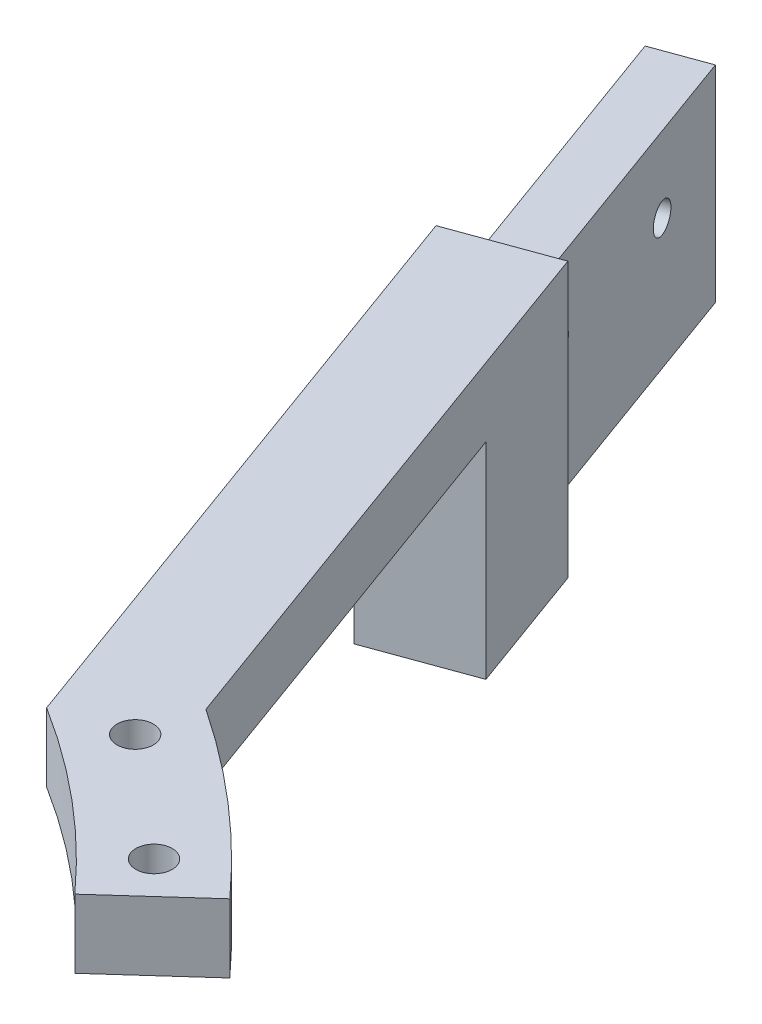
ISO-10303-21;
HEADER;
FILE_DESCRIPTION(('STEP AP214'),'2;1');
FILE_NAME('part.step','',(''),(''),'','','');
FILE_SCHEMA(('AUTOMOTIVE_DESIGN { 1 0 10303 214 1 1 1 1 }'));
ENDSEC;
DATA;
#1=APPLICATION_CONTEXT('core data for automotive mechanical design processes');
#2=APPLICATION_PROTOCOL_DEFINITION('international standard','automotive_design',2000,#1);
#3=PRODUCT_CONTEXT('',#1,'mechanical');
#4=PRODUCT('Part','Part','',(#3));
#5=PRODUCT_RELATED_PRODUCT_CATEGORY('part','',(#4));
#6=PRODUCT_DEFINITION_FORMATION('','',#4);
#7=PRODUCT_DEFINITION_CONTEXT('part definition',#1,'design');
#8=PRODUCT_DEFINITION('design','',#6,#7);
#9=PRODUCT_DEFINITION_SHAPE('','',#8);
#10=(LENGTH_UNIT() NAMED_UNIT(*) SI_UNIT(.MILLI.,.METRE.));
#11=(NAMED_UNIT(*) PLANE_ANGLE_UNIT() SI_UNIT($,.RADIAN.));
#12=(NAMED_UNIT(*) SI_UNIT($,.STERADIAN.) SOLID_ANGLE_UNIT());
#13=UNCERTAINTY_MEASURE_WITH_UNIT(LENGTH_MEASURE(1.E-05),#10,'distance_accuracy_value','');
#14=(GEOMETRIC_REPRESENTATION_CONTEXT(3) GLOBAL_UNCERTAINTY_ASSIGNED_CONTEXT((#13)) GLOBAL_UNIT_ASSIGNED_CONTEXT((#10,
#11,#12)) REPRESENTATION_CONTEXT('',''));
#15=CARTESIAN_POINT('',(0.,0.,0.));
#16=DIRECTION('',(0.,0.,1.));
#17=DIRECTION('',(1.,0.,0.));
#18=AXIS2_PLACEMENT_3D('',#15,#16,#17);
#19=CARTESIAN_POINT('',(13.6553707824387,0.,-238.960894173514));
#20=DIRECTION('',(0.,-1.,0.));
#21=DIRECTION('',(1.,0.,0.));
#22=AXIS2_PLACEMENT_3D('',#19,#20,#21);
#23=PLANE('',#22);
#24=DIRECTION('',(0.342020143325661,0.,0.939692620785911));
#25=VECTOR('',#24,1.);
#26=CARTESIAN_POINT('',(21.172911748726,0.,-241.697055320119));
#27=LINE('',#26,#25);
#28=CARTESIAN_POINT('',(21.172911748726,0.,-241.697055320119));
#29=VERTEX_POINT('',#28);
#30=CARTESIAN_POINT('',(38.6159390583347,0.,-193.772731660038));
#31=VERTEX_POINT('',#30);
#32=EDGE_CURVE('E74',#29,#31,#27,.T.);
#33=ORIENTED_EDGE('',*,*,#32,.F.);
#34=DIRECTION('',(0.939692620785911,0.,-0.34202014332566));
#35=VECTOR('',#34,1.);
#36=CARTESIAN_POINT('',(13.6553707824387,0.,-238.960894173514));
#37=LINE('',#36,#35);
#38=CARTESIAN_POINT('',(13.6553707824387,0.,-238.960894173514));
#39=VERTEX_POINT('',#38);
#40=EDGE_CURVE('E104',#39,#29,#37,.T.);
#41=ORIENTED_EDGE('',*,*,#40,.F.);
#42=DIRECTION('',(0.342020143325661,0.,0.939692620785911));
#43=VECTOR('',#42,1.);
#44=CARTESIAN_POINT('',(13.6553707824387,0.,-238.960894173514));
#45=LINE('',#44,#43);
#46=CARTESIAN_POINT('',(31.0983980920474,0.,-191.036570513432));
#47=VERTEX_POINT('',#46);
#48=EDGE_CURVE('E66',#39,#47,#45,.T.);
#49=ORIENTED_EDGE('',*,*,#48,.T.);
#50=DIRECTION('',(0.939692620785911,0.,-0.34202014332566));
#51=VECTOR('',#50,1.);
#52=CARTESIAN_POINT('',(31.0983980920474,0.,-191.036570513432));
#53=LINE('',#52,#51);
#54=EDGE_CURVE('E109',#47,#31,#53,.T.);
#55=ORIENTED_EDGE('',*,*,#54,.T.);
#56=EDGE_LOOP('',(#33,#41,#49,#55));
#57=FACE_BOUND('',#56,.T.);
#58=ADVANCED_FACE('F57',(#57),#23,.F.);
#59=CARTESIAN_POINT('',(13.6553707824387,-30.,-238.960894173514));
#60=DIRECTION('',(0.,-1.,0.));
#61=DIRECTION('',(1.,0.,0.));
#62=AXIS2_PLACEMENT_3D('',#59,#60,#61);
#63=PLANE('',#62);
#64=DIRECTION('',(0.939692620785911,0.,-0.34202014332566));
#65=VECTOR('',#64,1.);
#66=CARTESIAN_POINT('',(13.6553707824387,-30.,-238.960894173514));
#67=LINE('',#66,#65);
#68=CARTESIAN_POINT('',(13.6553707824387,-30.,-238.960894173514));
#69=VERTEX_POINT('',#68);
#70=CARTESIAN_POINT('',(21.172911748726,-30.,-241.697055320119));
#71=VERTEX_POINT('',#70);
#72=EDGE_CURVE('E144',#69,#71,#67,.T.);
#73=ORIENTED_EDGE('',*,*,#72,.T.);
#74=DIRECTION('',(-0.342020143325661,0.,-0.939692620785911));
#75=VECTOR('',#74,1.);
#76=CARTESIAN_POINT('',(38.6159390583347,-30.,-193.772731660038));
#77=LINE('',#76,#75);
#78=CARTESIAN_POINT('',(38.6159390583347,-30.,-193.772731660038));
#79=VERTEX_POINT('',#78);
#80=EDGE_CURVE('E153',#79,#71,#77,.T.);
#81=ORIENTED_EDGE('',*,*,#80,.F.);
#82=DIRECTION('',(0.939692620785911,0.,-0.34202014332566));
#83=VECTOR('',#82,1.);
#84=CARTESIAN_POINT('',(31.0983980920474,-30.,-191.036570513432));
#85=LINE('',#84,#83);
#86=CARTESIAN_POINT('',(31.0983980920474,-30.,-191.036570513432));
#87=VERTEX_POINT('',#86);
#88=EDGE_CURVE('E105',#87,#79,#85,.T.);
#89=ORIENTED_EDGE('',*,*,#88,.F.);
#90=DIRECTION('',(0.342020143325661,0.,0.939692620785911));
#91=VECTOR('',#90,1.);
#92=CARTESIAN_POINT('',(13.6553707824387,-30.,-238.960894173514));
#93=LINE('',#92,#91);
#94=EDGE_CURVE('E12',#69,#87,#93,.T.);
#95=ORIENTED_EDGE('',*,*,#94,.F.);
#96=EDGE_LOOP('',(#73,#81,#89,#95));
#97=FACE_BOUND('',#96,.T.);
#98=ADVANCED_FACE('F162',(#97),#63,.T.);
#99=CARTESIAN_POINT('',(-75.2031760492629,0.,-206.619028066626));
#100=DIRECTION('',(0.34202014332566,0.,0.939692620785911));
#101=DIRECTION('',(0.939692620785911,0.,-0.34202014332566));
#102=AXIS2_PLACEMENT_3D('',#99,#100,#101);
#103=PLANE('',#102);
#104=DIRECTION('',(0.,1.,0.));
#105=VECTOR('',#104,1.);
#106=CARTESIAN_POINT('',(21.172911748726,-30.,-241.697055320119));
#107=LINE('',#106,#105);
#108=EDGE_CURVE('E139',#71,#29,#107,.T.);
#109=ORIENTED_EDGE('',*,*,#108,.F.);
#110=ORIENTED_EDGE('',*,*,#72,.F.);
#111=DIRECTION('',(0.,1.,0.));
#112=VECTOR('',#111,1.);
#113=CARTESIAN_POINT('',(13.6553707824387,-30.,-238.960894173514));
#114=LINE('',#113,#112);
#115=EDGE_CURVE('E83',#69,#39,#114,.T.);
#116=ORIENTED_EDGE('',*,*,#115,.T.);
#117=ORIENTED_EDGE('',*,*,#40,.T.);
#118=EDGE_LOOP('',(#109,#110,#116,#117));
#119=FACE_BOUND('',#118,.T.);
#120=ADVANCED_FACE('F163',(#119),#103,.F.);
#121=CARTESIAN_POINT('',(-57.7601487396542,0.,-158.694704406545));
#122=DIRECTION('',(0.34202014332566,0.,0.939692620785911));
#123=DIRECTION('',(0.939692620785911,0.,-0.34202014332566));
#124=AXIS2_PLACEMENT_3D('',#121,#122,#123);
#125=PLANE('',#124);
#126=ORIENTED_EDGE('',*,*,#88,.T.);
#127=DIRECTION('',(0.,-1.,0.));
#128=VECTOR('',#127,1.);
#129=CARTESIAN_POINT('',(38.6159390583347,0.,-193.772731660038));
#130=LINE('',#129,#128);
#131=EDGE_CURVE('E113',#31,#79,#130,.T.);
#132=ORIENTED_EDGE('',*,*,#131,.F.);
#133=ORIENTED_EDGE('',*,*,#54,.F.);
#134=DIRECTION('',(0.,1.,0.));
#135=VECTOR('',#134,1.);
#136=CARTESIAN_POINT('',(31.0983980920474,-30.,-191.036570513432));
#137=LINE('',#136,#135);
#138=EDGE_CURVE('E95',#87,#47,#137,.T.);
#139=ORIENTED_EDGE('',*,*,#138,.F.);
#140=EDGE_LOOP('',(#126,#132,#133,#139));
#141=FACE_BOUND('',#140,.T.);
#142=ADVANCED_FACE('F112',(#141),#125,.T.);
#143=CARTESIAN_POINT('',(-32.8923865597313,-11.,-208.184584986932));
#144=DIRECTION('',(0.939692620785911,0.,-0.342020143325661));
#145=DIRECTION('',(-0.342020143325661,0.,-0.939692620785911));
#146=AXIS2_PLACEMENT_3D('',#143,#144,#145);
#147=CYLINDRICAL_SURFACE('',#146,2.15000000000002);
#148=CARTESIAN_POINT('',(18.1016326456723,-11.,-226.744890103297));
#149=DIRECTION('',(0.939692620785911,0.,-0.342020143325661));
#150=DIRECTION('',(-0.342020143325661,0.,-0.939692620785911));
#151=AXIS2_PLACEMENT_3D('',#148,#149,#150);
#152=CIRCLE('',#151,2.15000000000002);
#153=CARTESIAN_POINT('',(17.3662893375221,-11.,-228.765229237987));
#154=VERTEX_POINT('',#153);
#155=EDGE_CURVE('E122',#154,#154,#152,.T.);
#156=ORIENTED_EDGE('',*,*,#155,.F.);
#157=EDGE_LOOP('',(#156));
#158=FACE_BOUND('',#157,.T.);
#159=CARTESIAN_POINT('',(25.6191736119596,-11.,-229.481051249902));
#160=DIRECTION('',(0.939692620785911,0.,-0.342020143325661));
#161=DIRECTION('',(-0.342020143325661,0.,-0.939692620785911));
#162=AXIS2_PLACEMENT_3D('',#159,#160,#161);
#163=CIRCLE('',#162,2.15000000000002);
#164=CARTESIAN_POINT('',(24.8838303038095,-11.,-231.501390384592));
#165=VERTEX_POINT('',#164);
#166=EDGE_CURVE('E128',#165,#165,#163,.F.);
#167=ORIENTED_EDGE('',*,*,#166,.F.);
#168=EDGE_LOOP('',(#167));
#169=FACE_BOUND('',#168,.T.);
#170=ADVANCED_FACE('F171',(#158,#169),#147,.F.);
#171=CARTESIAN_POINT('',(-24.3418829765898,-11.,-184.692269467284));
#172=DIRECTION('',(0.939692620785911,0.,-0.342020143325661));
#173=DIRECTION('',(-0.342020143325661,0.,-0.939692620785911));
#174=AXIS2_PLACEMENT_3D('',#171,#172,#173);
#175=CYLINDRICAL_SURFACE('',#174,2.15000000000002);
#176=CARTESIAN_POINT('',(26.6521362288138,-11.,-203.252574583649));
#177=DIRECTION('',(0.939692620785911,0.,-0.342020143325661));
#178=DIRECTION('',(-0.342020143325661,0.,-0.939692620785911));
#179=AXIS2_PLACEMENT_3D('',#176,#177,#178);
#180=CIRCLE('',#179,2.15000000000002);
#181=CARTESIAN_POINT('',(25.9167929206636,-11.,-205.272913718339));
#182=VERTEX_POINT('',#181);
#183=EDGE_CURVE('E115',#182,#182,#180,.T.);
#184=ORIENTED_EDGE('',*,*,#183,.F.);
#185=EDGE_LOOP('',(#184));
#186=FACE_BOUND('',#185,.T.);
#187=CARTESIAN_POINT('',(34.1696771951011,-11.,-205.988735730255));
#188=DIRECTION('',(0.939692620785911,0.,-0.342020143325661));
#189=DIRECTION('',(-0.342020143325661,0.,-0.939692620785911));
#190=AXIS2_PLACEMENT_3D('',#187,#188,#189);
#191=CIRCLE('',#190,2.15000000000002);
#192=CARTESIAN_POINT('',(33.4343338869509,-11.,-208.009074864944));
#193=VERTEX_POINT('',#192);
#194=EDGE_CURVE('E60',#193,#193,#191,.F.);
#195=ORIENTED_EDGE('',*,*,#194,.F.);
#196=EDGE_LOOP('',(#195));
#197=FACE_BOUND('',#196,.T.);
#198=ADVANCED_FACE('F195',(#186,#197),#175,.F.);
#199=CARTESIAN_POINT('',(13.6553707824387,-30.,-238.960894173514));
#200=DIRECTION('',(0.939692620785911,0.,-0.342020143325661));
#201=DIRECTION('',(-0.342020143325661,0.,-0.939692620785911));
#202=AXIS2_PLACEMENT_3D('',#199,#200,#201);
#203=PLANE('',#202);
#204=ORIENTED_EDGE('',*,*,#183,.T.);
#205=EDGE_LOOP('',(#204));
#206=FACE_BOUND('',#205,.T.);
#207=ORIENTED_EDGE('',*,*,#155,.T.);
#208=EDGE_LOOP('',(#207));
#209=FACE_BOUND('',#208,.T.);
#210=ORIENTED_EDGE('',*,*,#138,.T.);
#211=ORIENTED_EDGE('',*,*,#48,.F.);
#212=ORIENTED_EDGE('',*,*,#115,.F.);
#213=ORIENTED_EDGE('',*,*,#94,.T.);
#214=EDGE_LOOP('',(#210,#211,#212,#213));
#215=FACE_BOUND('',#214,.T.);
#216=ADVANCED_FACE('F97',(#206,#209,#215),#203,.F.);
#217=CARTESIAN_POINT('',(96.376087797989,0.,-35.0780272534932));
#218=DIRECTION('',(0.939692620785911,0.,-0.342020143325661));
#219=DIRECTION('',(-0.342020143325661,0.,-0.939692620785911));
#220=AXIS2_PLACEMENT_3D('',#217,#218,#219);
#221=PLANE('',#220);
#222=ORIENTED_EDGE('',*,*,#32,.T.);
#223=ORIENTED_EDGE('',*,*,#131,.T.);
#224=ORIENTED_EDGE('',*,*,#80,.T.);
#225=ORIENTED_EDGE('',*,*,#108,.T.);
#226=EDGE_LOOP('',(#222,#223,#224,#225));
#227=FACE_BOUND('',#226,.T.);
#228=ORIENTED_EDGE('',*,*,#194,.T.);
#229=EDGE_LOOP('',(#228));
#230=FACE_BOUND('',#229,.T.);
#231=ORIENTED_EDGE('',*,*,#166,.T.);
#232=EDGE_LOOP('',(#231));
#233=FACE_BOUND('',#232,.T.);
#234=ADVANCED_FACE('F159',(#227,#230,#233),#221,.T.);
#235=CLOSED_SHELL('',(#58,#98,#120,#142,#170,#198,#216,#234));
#236=MANIFOLD_SOLID_BREP('B2',#235);
#237=CARTESIAN_POINT('',(0.,0.,0.));
#238=DIRECTION('',(0.,1.,0.));
#239=DIRECTION('',(0.,0.,1.));
#240=AXIS2_PLACEMENT_3D('',#237,#238,#239);
#241=PLANE('',#240);
#242=CARTESIAN_POINT('',(73.4177838529336,0.,-104.851461668991));
#243=DIRECTION('',(0.,1.,0.));
#244=DIRECTION('',(0.,0.,1.));
#245=AXIS2_PLACEMENT_3D('',#242,#243,#244);
#246=CIRCLE('',#245,2.65);
#247=CARTESIAN_POINT('',(73.4177838529336,0.,-102.201461668991));
#248=VERTEX_POINT('',#247);
#249=EDGE_CURVE('E387',#248,#248,#246,.T.);
#250=ORIENTED_EDGE('',*,*,#249,.T.);
#251=EDGE_LOOP('',(#250));
#252=FACE_BOUND('',#251,.T.);
#253=CARTESIAN_POINT('',(90.5096679918779,0.,-90.5096679918783));
#254=DIRECTION('',(0.,1.,0.));
#255=DIRECTION('',(0.,0.,1.));
#256=AXIS2_PLACEMENT_3D('',#253,#254,#255);
#257=CIRCLE('',#256,2.65000000000001);
#258=CARTESIAN_POINT('',(90.5096679918779,0.,-87.8596679918783));
#259=VERTEX_POINT('',#258);
#260=EDGE_CURVE('E367',#259,#259,#257,.T.);
#261=ORIENTED_EDGE('',*,*,#260,.T.);
#262=EDGE_LOOP('',(#261));
#263=FACE_BOUND('',#262,.T.);
#264=DIRECTION('',(-0.939692620785912,0.,0.342020143325659));
#265=VECTOR('',#264,1.);
#266=CARTESIAN_POINT('',(37.9388009585606,0.,-172.242718097714));
#267=LINE('',#266,#265);
#268=CARTESIAN_POINT('',(52.0341902703492,0.,-177.373020247599));
#269=VERTEX_POINT('',#268);
#270=CARTESIAN_POINT('',(37.9388009585606,0.,-172.242718097714));
#271=VERTEX_POINT('',#270);
#272=EDGE_CURVE('E279',#269,#271,#267,.T.);
#273=ORIENTED_EDGE('',*,*,#272,.F.);
#274=DIRECTION('',(0.34202014332566,0.,0.939692620785912));
#275=VECTOR('',#274,1.);
#276=CARTESIAN_POINT('',(102.95393614349,0.,-37.4721682567726));
#277=LINE('',#276,#275);
#278=CARTESIAN_POINT('',(75.3956779225557,0.,-113.187860438292));
#279=VERTEX_POINT('',#278);
#280=EDGE_CURVE('E382',#269,#279,#277,.T.);
#281=ORIENTED_EDGE('',*,*,#280,.T.);
#282=CARTESIAN_POINT('',(0.,0.,0.));
#283=DIRECTION('',(0.,1.,0.));
#284=DIRECTION('',(0.,0.,1.));
#285=AXIS2_PLACEMENT_3D('',#282,#283,#284);
#286=CIRCLE('',#285,136.);
#287=CARTESIAN_POINT('',(101.067696264925,0.,-91.0017624648049));
#288=VERTEX_POINT('',#287);
#289=EDGE_CURVE('E379',#288,#279,#286,.T.);
#290=ORIENTED_EDGE('',*,*,#289,.F.);
#291=DIRECTION('',(0.743144825477393,0.,-0.66913060635886));
#292=VECTOR('',#291,1.);
#293=CARTESIAN_POINT('',(0.,0.,0.));
#294=LINE('',#293,#292);
#295=CARTESIAN_POINT('',(89.1773790572872,0.,-80.2956727630632));
#296=VERTEX_POINT('',#295);
#297=EDGE_CURVE('E375',#296,#288,#294,.T.);
#298=ORIENTED_EDGE('',*,*,#297,.F.);
#299=CARTESIAN_POINT('',(0.,0.,0.));
#300=DIRECTION('',(0.,1.,0.));
#301=DIRECTION('',(0.,0.,1.));
#302=AXIS2_PLACEMENT_3D('',#299,#300,#301);
#303=CIRCLE('',#302,120.);
#304=CARTESIAN_POINT('',(63.5903117079851,0.,-101.765771538771));
#305=VERTEX_POINT('',#304);
#306=EDGE_CURVE('E371',#296,#305,#303,.T.);
#307=ORIENTED_EDGE('',*,*,#306,.T.);
#308=DIRECTION('',(-0.34202014332566,0.,-0.939692620785912));
#309=VECTOR('',#308,1.);
#310=CARTESIAN_POINT('',(88.8585468317015,0.,-32.3418661068877));
#311=LINE('',#310,#309);
#312=EDGE_CURVE('E385',#305,#271,#311,.T.);
#313=ORIENTED_EDGE('',*,*,#312,.T.);
#314=EDGE_LOOP('',(#273,#281,#290,#298,#307,#313));
#315=FACE_BOUND('',#314,.T.);
#316=ADVANCED_FACE('F263',(#252,#263,#315),#241,.F.);
#317=CARTESIAN_POINT('',(0.,10.,0.));
#318=DIRECTION('',(0.,-1.,0.));
#319=DIRECTION('',(0.,0.,-1.));
#320=AXIS2_PLACEMENT_3D('',#317,#318,#319);
#321=CYLINDRICAL_SURFACE('',#320,120.);
#322=ORIENTED_EDGE('',*,*,#306,.F.);
#323=DIRECTION('',(0.,-1.,0.));
#324=VECTOR('',#323,1.);
#325=CARTESIAN_POINT('',(89.1773790572872,10.,-80.2956727630632));
#326=LINE('',#325,#324);
#327=CARTESIAN_POINT('',(89.1773790572872,10.,-80.2956727630632));
#328=VERTEX_POINT('',#327);
#329=EDGE_CURVE('E55',#328,#296,#326,.T.);
#330=ORIENTED_EDGE('',*,*,#329,.F.);
#331=CARTESIAN_POINT('',(0.,10.,0.));
#332=DIRECTION('',(0.,1.,0.));
#333=DIRECTION('',(0.,0.,1.));
#334=AXIS2_PLACEMENT_3D('',#331,#332,#333);
#335=CIRCLE('',#334,120.);
#336=CARTESIAN_POINT('',(63.5903117079851,10.,-101.765771538771));
#337=VERTEX_POINT('',#336);
#338=EDGE_CURVE('E466',#328,#337,#335,.T.);
#339=ORIENTED_EDGE('',*,*,#338,.T.);
#340=DIRECTION('',(0.,-1.,0.));
#341=VECTOR('',#340,1.);
#342=CARTESIAN_POINT('',(63.5903117079851,10.,-101.765771538771));
#343=LINE('',#342,#341);
#344=EDGE_CURVE('E288',#337,#305,#343,.T.);
#345=ORIENTED_EDGE('',*,*,#344,.T.);
#346=EDGE_LOOP('',(#322,#330,#339,#345));
#347=FACE_BOUND('',#346,.T.);
#348=ADVANCED_FACE('F407',(#347),#321,.F.);
#349=CARTESIAN_POINT('',(0.,10.,0.));
#350=DIRECTION('',(-0.66913060635886,0.,-0.743144825477393));
#351=DIRECTION('',(-0.743144825477393,0.,0.66913060635886));
#352=AXIS2_PLACEMENT_3D('',#349,#350,#351);
#353=PLANE('',#352);
#354=ORIENTED_EDGE('',*,*,#297,.T.);
#355=DIRECTION('',(0.,-1.,0.));
#356=VECTOR('',#355,1.);
#357=CARTESIAN_POINT('',(101.067696264925,10.,-91.0017624648049));
#358=LINE('',#357,#356);
#359=CARTESIAN_POINT('',(101.067696264925,10.,-91.0017624648049));
#360=VERTEX_POINT('',#359);
#361=EDGE_CURVE('E272',#360,#288,#358,.T.);
#362=ORIENTED_EDGE('',*,*,#361,.F.);
#363=DIRECTION('',(0.743144825477393,0.,-0.66913060635886));
#364=VECTOR('',#363,1.);
#365=CARTESIAN_POINT('',(0.,10.,0.));
#366=LINE('',#365,#364);
#367=EDGE_CURVE('E468',#328,#360,#366,.T.);
#368=ORIENTED_EDGE('',*,*,#367,.F.);
#369=ORIENTED_EDGE('',*,*,#329,.T.);
#370=EDGE_LOOP('',(#354,#362,#368,#369));
#371=FACE_BOUND('',#370,.T.);
#372=ADVANCED_FACE('F406',(#371),#353,.F.);
#373=CARTESIAN_POINT('',(0.,10.,0.));
#374=DIRECTION('',(0.,-1.,0.));
#375=DIRECTION('',(0.,0.,-1.));
#376=AXIS2_PLACEMENT_3D('',#373,#374,#375);
#377=CYLINDRICAL_SURFACE('',#376,136.);
#378=ORIENTED_EDGE('',*,*,#289,.T.);
#379=DIRECTION('',(0.,-1.,0.));
#380=VECTOR('',#379,1.);
#381=CARTESIAN_POINT('',(75.3956779225557,10.,-113.187860438292));
#382=LINE('',#381,#380);
#383=CARTESIAN_POINT('',(75.3956779225557,10.,-113.187860438292));
#384=VERTEX_POINT('',#383);
#385=EDGE_CURVE('E337',#384,#279,#382,.T.);
#386=ORIENTED_EDGE('',*,*,#385,.F.);
#387=CARTESIAN_POINT('',(0.,10.,0.));
#388=DIRECTION('',(0.,1.,0.));
#389=DIRECTION('',(0.,0.,1.));
#390=AXIS2_PLACEMENT_3D('',#387,#388,#389);
#391=CIRCLE('',#390,136.);
#392=EDGE_CURVE('E348',#360,#384,#391,.T.);
#393=ORIENTED_EDGE('',*,*,#392,.F.);
#394=ORIENTED_EDGE('',*,*,#361,.T.);
#395=EDGE_LOOP('',(#378,#386,#393,#394));
#396=FACE_BOUND('',#395,.T.);
#397=ADVANCED_FACE('F403',(#396),#377,.T.);
#398=CARTESIAN_POINT('',(102.95393614349,10.,-37.4721682567726));
#399=DIRECTION('',(0.939692620785912,0.,-0.34202014332566));
#400=DIRECTION('',(-0.34202014332566,0.,-0.939692620785912));
#401=AXIS2_PLACEMENT_3D('',#398,#399,#400);
#402=PLANE('',#401);
#403=ORIENTED_EDGE('',*,*,#280,.F.);
#404=DIRECTION('',(0.,1.,0.));
#405=VECTOR('',#404,1.);
#406=CARTESIAN_POINT('',(52.0341902703493,-30.,-177.373020247599));
#407=LINE('',#406,#405);
#408=CARTESIAN_POINT('',(52.0341902703493,-30.,-177.373020247599));
#409=VERTEX_POINT('',#408);
#410=EDGE_CURVE('E372',#409,#269,#407,.T.);
#411=ORIENTED_EDGE('',*,*,#410,.F.);
#412=DIRECTION('',(0.342020143325659,0.,0.939692620785912));
#413=VECTOR('',#412,1.);
#414=CARTESIAN_POINT('',(52.0341902703493,-30.,-177.373020247599));
#415=LINE('',#414,#413);
#416=CARTESIAN_POINT('',(45.1937874038361,-30.,-196.166872663317));
#417=VERTEX_POINT('',#416);
#418=EDGE_CURVE('E331',#417,#409,#415,.T.);
#419=ORIENTED_EDGE('',*,*,#418,.F.);
#420=DIRECTION('',(0.,-1.,0.));
#421=VECTOR('',#420,1.);
#422=CARTESIAN_POINT('',(45.1937874038361,10.,-196.166872663317));
#423=LINE('',#422,#421);
#424=CARTESIAN_POINT('',(45.1937874038361,10.,-196.166872663317));
#425=VERTEX_POINT('',#424);
#426=EDGE_CURVE('E324',#425,#417,#423,.T.);
#427=ORIENTED_EDGE('',*,*,#426,.F.);
#428=DIRECTION('',(0.34202014332566,0.,0.939692620785912));
#429=VECTOR('',#428,1.);
#430=CARTESIAN_POINT('',(102.95393614349,10.,-37.4721682567726));
#431=LINE('',#430,#429);
#432=EDGE_CURVE('E328',#425,#384,#431,.T.);
#433=ORIENTED_EDGE('',*,*,#432,.T.);
#434=ORIENTED_EDGE('',*,*,#385,.T.);
#435=EDGE_LOOP('',(#403,#411,#419,#427,#433,#434));
#436=FACE_BOUND('',#435,.T.);
#437=ADVANCED_FACE('F326',(#436),#402,.T.);
#438=CARTESIAN_POINT('',(-57.7601487396542,10.,-158.694704406545));
#439=DIRECTION('',(-0.342020143325661,0.,-0.939692620785911));
#440=DIRECTION('',(-0.939692620785911,0.,0.342020143325661));
#441=AXIS2_PLACEMENT_3D('',#438,#439,#440);
#442=PLANE('',#441);
#443=ORIENTED_EDGE('',*,*,#426,.T.);
#444=DIRECTION('',(0.939692620785911,0.,-0.342020143325662));
#445=VECTOR('',#444,1.);
#446=CARTESIAN_POINT('',(45.1937874038361,-30.,-196.166872663317));
#447=LINE('',#446,#445);
#448=CARTESIAN_POINT('',(31.0983980920474,-30.,-191.036570513432));
#449=VERTEX_POINT('',#448);
#450=EDGE_CURVE('E449',#449,#417,#447,.T.);
#451=ORIENTED_EDGE('',*,*,#450,.F.);
#452=DIRECTION('',(0.,-1.,0.));
#453=VECTOR('',#452,1.);
#454=CARTESIAN_POINT('',(31.0983980920474,10.,-191.036570513432));
#455=LINE('',#454,#453);
#456=CARTESIAN_POINT('',(31.0983980920474,10.,-191.036570513432));
#457=VERTEX_POINT('',#456);
#458=EDGE_CURVE('E338',#457,#449,#455,.T.);
#459=ORIENTED_EDGE('',*,*,#458,.F.);
#460=DIRECTION('',(0.939692620785911,0.,-0.342020143325661));
#461=VECTOR('',#460,1.);
#462=CARTESIAN_POINT('',(-57.7601487396542,10.,-158.694704406545));
#463=LINE('',#462,#461);
#464=EDGE_CURVE('E346',#457,#425,#463,.T.);
#465=ORIENTED_EDGE('',*,*,#464,.T.);
#466=EDGE_LOOP('',(#443,#451,#459,#465));
#467=FACE_BOUND('',#466,.T.);
#468=ADVANCED_FACE('F352',(#467),#442,.T.);
#469=CARTESIAN_POINT('',(88.8585468317015,10.,-32.3418661068877));
#470=DIRECTION('',(-0.939692620785912,0.,0.34202014332566));
#471=DIRECTION('',(0.34202014332566,0.,0.939692620785912));
#472=AXIS2_PLACEMENT_3D('',#469,#470,#471);
#473=PLANE('',#472);
#474=ORIENTED_EDGE('',*,*,#312,.F.);
#475=ORIENTED_EDGE('',*,*,#344,.F.);
#476=DIRECTION('',(-0.34202014332566,0.,-0.939692620785912));
#477=VECTOR('',#476,1.);
#478=CARTESIAN_POINT('',(88.8585468317015,10.,-32.3418661068877));
#479=LINE('',#478,#477);
#480=EDGE_CURVE('E355',#337,#457,#479,.T.);
#481=ORIENTED_EDGE('',*,*,#480,.T.);
#482=ORIENTED_EDGE('',*,*,#458,.T.);
#483=DIRECTION('',(-0.34202014332566,0.,-0.939692620785912));
#484=VECTOR('',#483,1.);
#485=CARTESIAN_POINT('',(31.0983980920474,-30.,-191.036570513432));
#486=LINE('',#485,#484);
#487=CARTESIAN_POINT('',(37.9388009585606,-30.,-172.242718097714));
#488=VERTEX_POINT('',#487);
#489=EDGE_CURVE('E472',#488,#449,#486,.T.);
#490=ORIENTED_EDGE('',*,*,#489,.F.);
#491=DIRECTION('',(0.,1.,0.));
#492=VECTOR('',#491,1.);
#493=CARTESIAN_POINT('',(37.9388009585606,-30.,-172.242718097714));
#494=LINE('',#493,#492);
#495=EDGE_CURVE('E455',#488,#271,#494,.T.);
#496=ORIENTED_EDGE('',*,*,#495,.T.);
#497=EDGE_LOOP('',(#474,#475,#481,#482,#490,#496));
#498=FACE_BOUND('',#497,.T.);
#499=ADVANCED_FACE('F423',(#498),#473,.T.);
#500=CARTESIAN_POINT('',(90.5096679918779,10.,-90.5096679918783));
#501=DIRECTION('',(0.,-1.,0.));
#502=DIRECTION('',(0.,0.,-1.));
#503=AXIS2_PLACEMENT_3D('',#500,#501,#502);
#504=CYLINDRICAL_SURFACE('',#503,2.65000000000001);
#505=CARTESIAN_POINT('',(90.5096679918779,10.,-90.5096679918783));
#506=DIRECTION('',(0.,1.,0.));
#507=DIRECTION('',(0.,0.,1.));
#508=AXIS2_PLACEMENT_3D('',#505,#506,#507);
#509=CIRCLE('',#508,2.65000000000001);
#510=CARTESIAN_POINT('',(90.5096679918779,10.,-87.8596679918783));
#511=VERTEX_POINT('',#510);
#512=EDGE_CURVE('E391',#511,#511,#509,.T.);
#513=ORIENTED_EDGE('',*,*,#512,.T.);
#514=EDGE_LOOP('',(#513));
#515=FACE_BOUND('',#514,.T.);
#516=ORIENTED_EDGE('',*,*,#260,.F.);
#517=EDGE_LOOP('',(#516));
#518=FACE_BOUND('',#517,.T.);
#519=ADVANCED_FACE('F265',(#515,#518),#504,.F.);
#520=CARTESIAN_POINT('',(73.4177838529336,10.,-104.851461668991));
#521=DIRECTION('',(0.,-1.,0.));
#522=DIRECTION('',(0.,0.,-1.));
#523=AXIS2_PLACEMENT_3D('',#520,#521,#522);
#524=CYLINDRICAL_SURFACE('',#523,2.65);
#525=CARTESIAN_POINT('',(73.4177838529336,10.,-104.851461668991));
#526=DIRECTION('',(0.,1.,0.));
#527=DIRECTION('',(0.,0.,1.));
#528=AXIS2_PLACEMENT_3D('',#525,#526,#527);
#529=CIRCLE('',#528,2.65);
#530=CARTESIAN_POINT('',(73.4177838529336,10.,-102.201461668991));
#531=VERTEX_POINT('',#530);
#532=EDGE_CURVE('E360',#531,#531,#529,.T.);
#533=ORIENTED_EDGE('',*,*,#532,.T.);
#534=EDGE_LOOP('',(#533));
#535=FACE_BOUND('',#534,.T.);
#536=ORIENTED_EDGE('',*,*,#249,.F.);
#537=EDGE_LOOP('',(#536));
#538=FACE_BOUND('',#537,.T.);
#539=ADVANCED_FACE('F426',(#535,#538),#524,.F.);
#540=CARTESIAN_POINT('',(0.,10.,0.));
#541=DIRECTION('',(0.,1.,0.));
#542=DIRECTION('',(0.,0.,1.));
#543=AXIS2_PLACEMENT_3D('',#540,#541,#542);
#544=PLANE('',#543);
#545=ORIENTED_EDGE('',*,*,#512,.F.);
#546=EDGE_LOOP('',(#545));
#547=FACE_BOUND('',#546,.T.);
#548=ORIENTED_EDGE('',*,*,#338,.F.);
#549=ORIENTED_EDGE('',*,*,#367,.T.);
#550=ORIENTED_EDGE('',*,*,#392,.T.);
#551=ORIENTED_EDGE('',*,*,#432,.F.);
#552=ORIENTED_EDGE('',*,*,#464,.F.);
#553=ORIENTED_EDGE('',*,*,#480,.F.);
#554=EDGE_LOOP('',(#548,#549,#550,#551,#552,#553));
#555=FACE_BOUND('',#554,.T.);
#556=ORIENTED_EDGE('',*,*,#532,.F.);
#557=EDGE_LOOP('',(#556));
#558=FACE_BOUND('',#557,.T.);
#559=ADVANCED_FACE('F343',(#547,#555,#558),#544,.T.);
#560=CARTESIAN_POINT('',(37.9388009585606,-30.,-172.242718097714));
#561=DIRECTION('',(-0.342020143325659,0.,-0.939692620785912));
#562=DIRECTION('',(-0.939692620785912,0.,0.342020143325659));
#563=AXIS2_PLACEMENT_3D('',#560,#561,#562);
#564=PLANE('',#563);
#565=ORIENTED_EDGE('',*,*,#272,.T.);
#566=ORIENTED_EDGE('',*,*,#495,.F.);
#567=DIRECTION('',(-0.939692620785912,0.,0.342020143325659));
#568=VECTOR('',#567,1.);
#569=CARTESIAN_POINT('',(37.9388009585606,-30.,-172.242718097714));
#570=LINE('',#569,#568);
#571=EDGE_CURVE('E447',#409,#488,#570,.T.);
#572=ORIENTED_EDGE('',*,*,#571,.F.);
#573=ORIENTED_EDGE('',*,*,#410,.T.);
#574=EDGE_LOOP('',(#565,#566,#572,#573));
#575=FACE_BOUND('',#574,.T.);
#576=ADVANCED_FACE('F432',(#575),#564,.F.);
#577=CARTESIAN_POINT('',(0.,-30.,0.));
#578=DIRECTION('',(0.,1.,0.));
#579=DIRECTION('',(0.,0.,1.));
#580=AXIS2_PLACEMENT_3D('',#577,#578,#579);
#581=PLANE('',#580);
#582=ORIENTED_EDGE('',*,*,#418,.T.);
#583=ORIENTED_EDGE('',*,*,#571,.T.);
#584=ORIENTED_EDGE('',*,*,#489,.T.);
#585=ORIENTED_EDGE('',*,*,#450,.T.);
#586=EDGE_LOOP('',(#582,#583,#584,#585));
#587=FACE_BOUND('',#586,.T.);
#588=ADVANCED_FACE('F436',(#587),#581,.F.);
#589=CLOSED_SHELL('',(#316,#348,#372,#397,#437,#468,#499,#519,#539,#559,#576,#588));
#590=MANIFOLD_SOLID_BREP('B6',#589);
#591=ADVANCED_BREP_SHAPE_REPRESENTATION('',(#18,#236,#590),#14);
#592=SHAPE_DEFINITION_REPRESENTATION(#9,#591);
ENDSEC;
END-ISO-10303-21;
